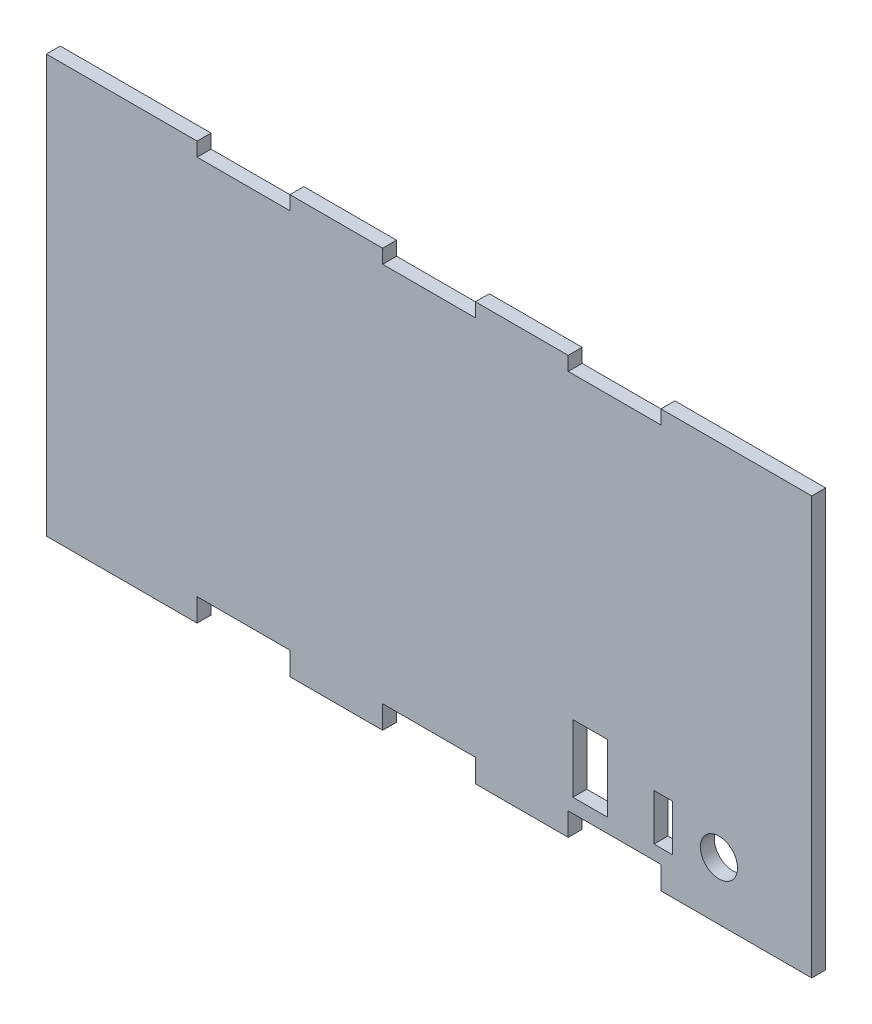
ISO-10303-21;
HEADER;
FILE_DESCRIPTION(('STEP AP214'),'2;1');
FILE_NAME('part.step','',(''),(''),'','','');
FILE_SCHEMA(('AUTOMOTIVE_DESIGN { 1 0 10303 214 1 1 1 1 }'));
ENDSEC;
DATA;
#1=APPLICATION_CONTEXT('core data for automotive mechanical design processes');
#2=APPLICATION_PROTOCOL_DEFINITION('international standard','automotive_design',2000,#1);
#3=PRODUCT_CONTEXT('',#1,'mechanical');
#4=PRODUCT('Part','Part','',(#3));
#5=PRODUCT_RELATED_PRODUCT_CATEGORY('part','',(#4));
#6=PRODUCT_DEFINITION_FORMATION('','',#4);
#7=PRODUCT_DEFINITION_CONTEXT('part definition',#1,'design');
#8=PRODUCT_DEFINITION('design','',#6,#7);
#9=PRODUCT_DEFINITION_SHAPE('','',#8);
#10=(LENGTH_UNIT() NAMED_UNIT(*) SI_UNIT(.MILLI.,.METRE.));
#11=(NAMED_UNIT(*) PLANE_ANGLE_UNIT() SI_UNIT($,.RADIAN.));
#12=(NAMED_UNIT(*) SI_UNIT($,.STERADIAN.) SOLID_ANGLE_UNIT());
#13=UNCERTAINTY_MEASURE_WITH_UNIT(LENGTH_MEASURE(1.E-05),#10,'distance_accuracy_value','');
#14=(GEOMETRIC_REPRESENTATION_CONTEXT(3) GLOBAL_UNCERTAINTY_ASSIGNED_CONTEXT((#13)) GLOBAL_UNIT_ASSIGNED_CONTEXT((#10,
#11,#12)) REPRESENTATION_CONTEXT('',''));
#15=CARTESIAN_POINT('',(0.,0.,0.));
#16=DIRECTION('',(0.,0.,1.));
#17=DIRECTION('',(1.,0.,0.));
#18=AXIS2_PLACEMENT_3D('',#15,#16,#17);
#19=CARTESIAN_POINT('',(0.,0.,6.));
#20=DIRECTION('',(0.,1.,0.));
#21=DIRECTION('',(-1.,0.,0.));
#22=AXIS2_PLACEMENT_3D('',#19,#20,#21);
#23=PLANE('',#22);
#24=DIRECTION('',(1.,0.,0.));
#25=VECTOR('',#24,1.);
#26=CARTESIAN_POINT('',(0.,0.,0.));
#27=LINE('',#26,#25);
#28=CARTESIAN_POINT('',(-145.,0.,0.));
#29=VERTEX_POINT('',#28);
#30=CARTESIAN_POINT('',(-105.,0.,0.));
#31=VERTEX_POINT('',#30);
#32=EDGE_CURVE('E657',#29,#31,#27,.T.);
#33=ORIENTED_EDGE('',*,*,#32,.T.);
#34=DIRECTION('',(0.,0.,1.));
#35=VECTOR('',#34,1.);
#36=CARTESIAN_POINT('',(-105.,0.,0.));
#37=LINE('',#36,#35);
#38=CARTESIAN_POINT('',(-105.,0.,6.));
#39=VERTEX_POINT('',#38);
#40=EDGE_CURVE('E326',#31,#39,#37,.T.);
#41=ORIENTED_EDGE('',*,*,#40,.T.);
#42=DIRECTION('',(1.,0.,0.));
#43=VECTOR('',#42,1.);
#44=CARTESIAN_POINT('',(0.,0.,6.));
#45=LINE('',#44,#43);
#46=CARTESIAN_POINT('',(-145.,0.,6.));
#47=VERTEX_POINT('',#46);
#48=EDGE_CURVE('E671',#47,#39,#45,.T.);
#49=ORIENTED_EDGE('',*,*,#48,.F.);
#50=DIRECTION('',(0.,0.,1.));
#51=VECTOR('',#50,1.);
#52=CARTESIAN_POINT('',(-145.,0.,0.));
#53=LINE('',#52,#51);
#54=EDGE_CURVE('E364',#29,#47,#53,.T.);
#55=ORIENTED_EDGE('',*,*,#54,.F.);
#56=EDGE_LOOP('',(#33,#41,#49,#55));
#57=FACE_BOUND('',#56,.T.);
#58=ADVANCED_FACE('F33',(#57),#23,.F.);
#59=CARTESIAN_POINT('',(-225.,0.,0.));
#60=VERTEX_POINT('',#59);
#61=CARTESIAN_POINT('',(-185.,0.,0.));
#62=VERTEX_POINT('',#61);
#63=EDGE_CURVE('E503',#60,#62,#27,.T.);
#64=ORIENTED_EDGE('',*,*,#63,.T.);
#65=DIRECTION('',(0.,0.,1.));
#66=VECTOR('',#65,1.);
#67=CARTESIAN_POINT('',(-185.,0.,0.));
#68=LINE('',#67,#66);
#69=CARTESIAN_POINT('',(-185.,0.,6.));
#70=VERTEX_POINT('',#69);
#71=EDGE_CURVE('E352',#62,#70,#68,.T.);
#72=ORIENTED_EDGE('',*,*,#71,.T.);
#73=CARTESIAN_POINT('',(-225.,0.,6.));
#74=VERTEX_POINT('',#73);
#75=EDGE_CURVE('E490',#74,#70,#45,.T.);
#76=ORIENTED_EDGE('',*,*,#75,.F.);
#77=DIRECTION('',(0.,0.,1.));
#78=VECTOR('',#77,1.);
#79=CARTESIAN_POINT('',(-225.,0.,0.));
#80=LINE('',#79,#78);
#81=EDGE_CURVE('E390',#60,#74,#80,.T.);
#82=ORIENTED_EDGE('',*,*,#81,.F.);
#83=EDGE_LOOP('',(#64,#72,#76,#82));
#84=FACE_BOUND('',#83,.T.);
#85=ADVANCED_FACE('F552',(#84),#23,.F.);
#86=CARTESIAN_POINT('',(-330.,0.,0.));
#87=VERTEX_POINT('',#86);
#88=CARTESIAN_POINT('',(-265.,0.,0.));
#89=VERTEX_POINT('',#88);
#90=EDGE_CURVE('E478',#87,#89,#27,.T.);
#91=ORIENTED_EDGE('',*,*,#90,.T.);
#92=DIRECTION('',(0.,0.,1.));
#93=VECTOR('',#92,1.);
#94=CARTESIAN_POINT('',(-265.,0.,0.));
#95=LINE('',#94,#93);
#96=CARTESIAN_POINT('',(-265.,0.,6.));
#97=VERTEX_POINT('',#96);
#98=EDGE_CURVE('E378',#89,#97,#95,.T.);
#99=ORIENTED_EDGE('',*,*,#98,.T.);
#100=CARTESIAN_POINT('',(-330.,0.,6.));
#101=VERTEX_POINT('',#100);
#102=EDGE_CURVE('E486',#101,#97,#45,.T.);
#103=ORIENTED_EDGE('',*,*,#102,.F.);
#104=DIRECTION('',(0.,0.,-1.));
#105=VECTOR('',#104,1.);
#106=CARTESIAN_POINT('',(-330.,0.,6.));
#107=LINE('',#106,#105);
#108=EDGE_CURVE('E506',#101,#87,#107,.T.);
#109=ORIENTED_EDGE('',*,*,#108,.T.);
#110=EDGE_LOOP('',(#91,#99,#103,#109));
#111=FACE_BOUND('',#110,.T.);
#112=ADVANCED_FACE('F559',(#111),#23,.F.);
#113=CARTESIAN_POINT('',(0.,180.,6.));
#114=DIRECTION('',(0.,-1.,0.));
#115=DIRECTION('',(1.,0.,0.));
#116=AXIS2_PLACEMENT_3D('',#113,#114,#115);
#117=PLANE('',#116);
#118=DIRECTION('',(-1.,0.,0.));
#119=VECTOR('',#118,1.);
#120=CARTESIAN_POINT('',(0.,180.,6.));
#121=LINE('',#120,#119);
#122=CARTESIAN_POINT('',(-105.,180.,6.));
#123=VERTEX_POINT('',#122);
#124=CARTESIAN_POINT('',(-145.,180.,6.));
#125=VERTEX_POINT('',#124);
#126=EDGE_CURVE('E483',#123,#125,#121,.T.);
#127=ORIENTED_EDGE('',*,*,#126,.F.);
#128=DIRECTION('',(0.,0.,1.));
#129=VECTOR('',#128,1.);
#130=CARTESIAN_POINT('',(-105.,180.,0.));
#131=LINE('',#130,#129);
#132=CARTESIAN_POINT('',(-105.,180.,0.));
#133=VERTEX_POINT('',#132);
#134=EDGE_CURVE('E411',#133,#123,#131,.T.);
#135=ORIENTED_EDGE('',*,*,#134,.F.);
#136=DIRECTION('',(-1.,0.,0.));
#137=VECTOR('',#136,1.);
#138=CARTESIAN_POINT('',(0.,180.,0.));
#139=LINE('',#138,#137);
#140=CARTESIAN_POINT('',(-145.,180.,0.));
#141=VERTEX_POINT('',#140);
#142=EDGE_CURVE('E498',#133,#141,#139,.T.);
#143=ORIENTED_EDGE('',*,*,#142,.T.);
#144=DIRECTION('',(0.,0.,1.));
#145=VECTOR('',#144,1.);
#146=CARTESIAN_POINT('',(-145.,180.,0.));
#147=LINE('',#146,#145);
#148=EDGE_CURVE('E441',#141,#125,#147,.T.);
#149=ORIENTED_EDGE('',*,*,#148,.T.);
#150=EDGE_LOOP('',(#127,#135,#143,#149));
#151=FACE_BOUND('',#150,.T.);
#152=ADVANCED_FACE('F578',(#151),#117,.F.);
#153=CARTESIAN_POINT('',(-185.,180.,6.));
#154=VERTEX_POINT('',#153);
#155=CARTESIAN_POINT('',(-225.,180.,6.));
#156=VERTEX_POINT('',#155);
#157=EDGE_CURVE('E626',#154,#156,#121,.T.);
#158=ORIENTED_EDGE('',*,*,#157,.F.);
#159=DIRECTION('',(0.,0.,1.));
#160=VECTOR('',#159,1.);
#161=CARTESIAN_POINT('',(-185.,180.,0.));
#162=LINE('',#161,#160);
#163=CARTESIAN_POINT('',(-185.,180.,0.));
#164=VERTEX_POINT('',#163);
#165=EDGE_CURVE('E438',#164,#154,#162,.T.);
#166=ORIENTED_EDGE('',*,*,#165,.F.);
#167=CARTESIAN_POINT('',(-225.,180.,0.));
#168=VERTEX_POINT('',#167);
#169=EDGE_CURVE('E606',#164,#168,#139,.T.);
#170=ORIENTED_EDGE('',*,*,#169,.T.);
#171=DIRECTION('',(0.,0.,1.));
#172=VECTOR('',#171,1.);
#173=CARTESIAN_POINT('',(-225.,180.,0.));
#174=LINE('',#173,#172);
#175=EDGE_CURVE('E468',#168,#156,#174,.T.);
#176=ORIENTED_EDGE('',*,*,#175,.T.);
#177=EDGE_LOOP('',(#158,#166,#170,#176));
#178=FACE_BOUND('',#177,.T.);
#179=ADVANCED_FACE('F583',(#178),#117,.F.);
#180=CARTESIAN_POINT('',(-265.,180.,6.));
#181=VERTEX_POINT('',#180);
#182=CARTESIAN_POINT('',(-330.,180.,6.));
#183=VERTEX_POINT('',#182);
#184=EDGE_CURVE('E477',#181,#183,#121,.T.);
#185=ORIENTED_EDGE('',*,*,#184,.F.);
#186=DIRECTION('',(0.,0.,1.));
#187=VECTOR('',#186,1.);
#188=CARTESIAN_POINT('',(-265.,180.,0.));
#189=LINE('',#188,#187);
#190=CARTESIAN_POINT('',(-265.,180.,0.));
#191=VERTEX_POINT('',#190);
#192=EDGE_CURVE('E465',#191,#181,#189,.T.);
#193=ORIENTED_EDGE('',*,*,#192,.F.);
#194=CARTESIAN_POINT('',(-330.,180.,0.));
#195=VERTEX_POINT('',#194);
#196=EDGE_CURVE('E493',#191,#195,#139,.T.);
#197=ORIENTED_EDGE('',*,*,#196,.T.);
#198=DIRECTION('',(0.,0.,-1.));
#199=VECTOR('',#198,1.);
#200=CARTESIAN_POINT('',(-330.,180.,6.));
#201=LINE('',#200,#199);
#202=EDGE_CURVE('E509',#183,#195,#201,.T.);
#203=ORIENTED_EDGE('',*,*,#202,.F.);
#204=EDGE_LOOP('',(#185,#193,#197,#203));
#205=FACE_BOUND('',#204,.T.);
#206=ADVANCED_FACE('F604',(#205),#117,.F.);
#207=CARTESIAN_POINT('',(0.,0.,6.));
#208=DIRECTION('',(-1.,0.,0.));
#209=DIRECTION('',(0.,0.,1.));
#210=AXIS2_PLACEMENT_3D('',#207,#208,#209);
#211=PLANE('',#210);
#212=DIRECTION('',(0.,1.,0.));
#213=VECTOR('',#212,1.);
#214=CARTESIAN_POINT('',(0.,0.,0.));
#215=LINE('',#214,#213);
#216=CARTESIAN_POINT('',(0.,0.,0.));
#217=VERTEX_POINT('',#216);
#218=CARTESIAN_POINT('',(0.,180.,0.));
#219=VERTEX_POINT('',#218);
#220=EDGE_CURVE('E467',#217,#219,#215,.T.);
#221=ORIENTED_EDGE('',*,*,#220,.T.);
#222=DIRECTION('',(0.,0.,-1.));
#223=VECTOR('',#222,1.);
#224=CARTESIAN_POINT('',(0.,180.,6.));
#225=LINE('',#224,#223);
#226=CARTESIAN_POINT('',(0.,180.,6.));
#227=VERTEX_POINT('',#226);
#228=EDGE_CURVE('E512',#227,#219,#225,.T.);
#229=ORIENTED_EDGE('',*,*,#228,.F.);
#230=DIRECTION('',(0.,1.,0.));
#231=VECTOR('',#230,1.);
#232=CARTESIAN_POINT('',(0.,0.,6.));
#233=LINE('',#232,#231);
#234=CARTESIAN_POINT('',(0.,0.,6.));
#235=VERTEX_POINT('',#234);
#236=EDGE_CURVE('E474',#235,#227,#233,.T.);
#237=ORIENTED_EDGE('',*,*,#236,.F.);
#238=DIRECTION('',(0.,0.,-1.));
#239=VECTOR('',#238,1.);
#240=CARTESIAN_POINT('',(0.,0.,6.));
#241=LINE('',#240,#239);
#242=EDGE_CURVE('E489',#235,#217,#241,.T.);
#243=ORIENTED_EDGE('',*,*,#242,.T.);
#244=EDGE_LOOP('',(#221,#229,#237,#243));
#245=FACE_BOUND('',#244,.T.);
#246=ADVANCED_FACE('F35',(#245),#211,.F.);
#247=CARTESIAN_POINT('',(-65.,180.,0.));
#248=VERTEX_POINT('',#247);
#249=EDGE_CURVE('E494',#219,#248,#139,.T.);
#250=ORIENTED_EDGE('',*,*,#249,.T.);
#251=DIRECTION('',(0.,0.,1.));
#252=VECTOR('',#251,1.);
#253=CARTESIAN_POINT('',(-65.,180.,0.));
#254=LINE('',#253,#252);
#255=CARTESIAN_POINT('',(-65.,180.,6.));
#256=VERTEX_POINT('',#255);
#257=EDGE_CURVE('E414',#248,#256,#254,.T.);
#258=ORIENTED_EDGE('',*,*,#257,.T.);
#259=EDGE_CURVE('E479',#227,#256,#121,.T.);
#260=ORIENTED_EDGE('',*,*,#259,.F.);
#261=ORIENTED_EDGE('',*,*,#228,.T.);
#262=EDGE_LOOP('',(#250,#258,#260,#261));
#263=FACE_BOUND('',#262,.T.);
#264=ADVANCED_FACE('F574',(#263),#117,.F.);
#265=CARTESIAN_POINT('',(-330.,0.,6.));
#266=DIRECTION('',(1.,0.,0.));
#267=DIRECTION('',(0.,0.,-1.));
#268=AXIS2_PLACEMENT_3D('',#265,#266,#267);
#269=PLANE('',#268);
#270=DIRECTION('',(0.,-1.,0.));
#271=VECTOR('',#270,1.);
#272=CARTESIAN_POINT('',(-330.,0.,0.));
#273=LINE('',#272,#271);
#274=EDGE_CURVE('E497',#195,#87,#273,.T.);
#275=ORIENTED_EDGE('',*,*,#274,.T.);
#276=ORIENTED_EDGE('',*,*,#108,.F.);
#277=DIRECTION('',(0.,-1.,0.));
#278=VECTOR('',#277,1.);
#279=CARTESIAN_POINT('',(-330.,0.,6.));
#280=LINE('',#279,#278);
#281=EDGE_CURVE('E482',#183,#101,#280,.T.);
#282=ORIENTED_EDGE('',*,*,#281,.F.);
#283=ORIENTED_EDGE('',*,*,#202,.T.);
#284=EDGE_LOOP('',(#275,#276,#282,#283));
#285=FACE_BOUND('',#284,.T.);
#286=ADVANCED_FACE('F565',(#285),#269,.F.);
#287=CARTESIAN_POINT('',(-65.,0.,6.));
#288=VERTEX_POINT('',#287);
#289=EDGE_CURVE('E485',#288,#235,#45,.T.);
#290=ORIENTED_EDGE('',*,*,#289,.F.);
#291=DIRECTION('',(0.,0.,1.));
#292=VECTOR('',#291,1.);
#293=CARTESIAN_POINT('',(-65.,0.,0.));
#294=LINE('',#293,#292);
#295=CARTESIAN_POINT('',(-65.,0.,0.));
#296=VERTEX_POINT('',#295);
#297=EDGE_CURVE('E338',#296,#288,#294,.T.);
#298=ORIENTED_EDGE('',*,*,#297,.F.);
#299=EDGE_CURVE('E500',#296,#217,#27,.T.);
#300=ORIENTED_EDGE('',*,*,#299,.T.);
#301=ORIENTED_EDGE('',*,*,#242,.F.);
#302=EDGE_LOOP('',(#290,#298,#300,#301));
#303=FACE_BOUND('',#302,.T.);
#304=ADVANCED_FACE('F555',(#303),#23,.F.);
#305=CARTESIAN_POINT('',(0.,0.,6.));
#306=DIRECTION('',(0.,0.,1.));
#307=DIRECTION('',(1.,0.,0.));
#308=AXIS2_PLACEMENT_3D('',#305,#306,#307);
#309=PLANE('',#308);
#310=CARTESIAN_POINT('',(-40.,25.,6.));
#311=DIRECTION('',(0.,0.,1.));
#312=DIRECTION('',(1.,0.,0.));
#313=AXIS2_PLACEMENT_3D('',#310,#311,#312);
#314=CIRCLE('',#313,8.00000000000001);
#315=CARTESIAN_POINT('',(-32.,25.,6.));
#316=VERTEX_POINT('',#315);
#317=EDGE_CURVE('E750',#316,#316,#314,.T.);
#318=ORIENTED_EDGE('',*,*,#317,.F.);
#319=EDGE_LOOP('',(#318));
#320=FACE_BOUND('',#319,.T.);
#321=DIRECTION('',(0.,-1.,0.));
#322=VECTOR('',#321,1.);
#323=CARTESIAN_POINT('',(-68.,36.,6.));
#324=LINE('',#323,#322);
#325=CARTESIAN_POINT('',(-68.,36.,6.));
#326=VERTEX_POINT('',#325);
#327=CARTESIAN_POINT('',(-68.,16.,6.));
#328=VERTEX_POINT('',#327);
#329=EDGE_CURVE('E49',#326,#328,#324,.T.);
#330=ORIENTED_EDGE('',*,*,#329,.F.);
#331=DIRECTION('',(-1.,0.,0.));
#332=VECTOR('',#331,1.);
#333=CARTESIAN_POINT('',(-68.,36.,6.));
#334=LINE('',#333,#332);
#335=CARTESIAN_POINT('',(-60.,36.,6.));
#336=VERTEX_POINT('',#335);
#337=EDGE_CURVE('E286',#336,#326,#334,.T.);
#338=ORIENTED_EDGE('',*,*,#337,.F.);
#339=DIRECTION('',(0.,1.,0.));
#340=VECTOR('',#339,1.);
#341=CARTESIAN_POINT('',(-60.,36.,6.));
#342=LINE('',#341,#340);
#343=CARTESIAN_POINT('',(-60.,16.,6.));
#344=VERTEX_POINT('',#343);
#345=EDGE_CURVE('E270',#344,#336,#342,.T.);
#346=ORIENTED_EDGE('',*,*,#345,.F.);
#347=DIRECTION('',(1.,0.,0.));
#348=VECTOR('',#347,1.);
#349=CARTESIAN_POINT('',(-68.,16.,6.));
#350=LINE('',#349,#348);
#351=EDGE_CURVE('E279',#328,#344,#350,.T.);
#352=ORIENTED_EDGE('',*,*,#351,.F.);
#353=EDGE_LOOP('',(#330,#338,#346,#352));
#354=FACE_BOUND('',#353,.T.);
#355=DIRECTION('',(0.,-1.,0.));
#356=VECTOR('',#355,1.);
#357=CARTESIAN_POINT('',(-103.,45.,6.));
#358=LINE('',#357,#356);
#359=CARTESIAN_POINT('',(-103.,45.,6.));
#360=VERTEX_POINT('',#359);
#361=CARTESIAN_POINT('',(-103.,16.,6.));
#362=VERTEX_POINT('',#361);
#363=EDGE_CURVE('E293',#360,#362,#358,.T.);
#364=ORIENTED_EDGE('',*,*,#363,.F.);
#365=DIRECTION('',(-1.,0.,0.));
#366=VECTOR('',#365,1.);
#367=CARTESIAN_POINT('',(-103.,45.,6.));
#368=LINE('',#367,#366);
#369=CARTESIAN_POINT('',(-88.,45.,6.));
#370=VERTEX_POINT('',#369);
#371=EDGE_CURVE('E303',#370,#360,#368,.T.);
#372=ORIENTED_EDGE('',*,*,#371,.F.);
#373=DIRECTION('',(0.,1.,0.));
#374=VECTOR('',#373,1.);
#375=CARTESIAN_POINT('',(-88.,45.,6.));
#376=LINE('',#375,#374);
#377=CARTESIAN_POINT('',(-88.,16.,6.));
#378=VERTEX_POINT('',#377);
#379=EDGE_CURVE('E300',#378,#370,#376,.T.);
#380=ORIENTED_EDGE('',*,*,#379,.F.);
#381=DIRECTION('',(1.,0.,0.));
#382=VECTOR('',#381,1.);
#383=CARTESIAN_POINT('',(-103.,16.,6.));
#384=LINE('',#383,#382);
#385=EDGE_CURVE('E297',#362,#378,#384,.T.);
#386=ORIENTED_EDGE('',*,*,#385,.F.);
#387=EDGE_LOOP('',(#364,#372,#380,#386));
#388=FACE_BOUND('',#387,.T.);
#389=DIRECTION('',(0.,-1.,0.));
#390=VECTOR('',#389,1.);
#391=CARTESIAN_POINT('',(-105.,0.,6.));
#392=LINE('',#391,#390);
#393=CARTESIAN_POINT('',(-105.,9.90358590712503,6.));
#394=VERTEX_POINT('',#393);
#395=EDGE_CURVE('E309',#394,#39,#392,.T.);
#396=ORIENTED_EDGE('',*,*,#395,.F.);
#397=DIRECTION('',(-1.,0.,0.));
#398=VECTOR('',#397,1.);
#399=CARTESIAN_POINT('',(-105.,9.90358590712503,6.));
#400=LINE('',#399,#398);
#401=CARTESIAN_POINT('',(-65.,9.90358590712503,6.));
#402=VERTEX_POINT('',#401);
#403=EDGE_CURVE('E320',#402,#394,#400,.T.);
#404=ORIENTED_EDGE('',*,*,#403,.F.);
#405=DIRECTION('',(0.,1.,0.));
#406=VECTOR('',#405,1.);
#407=CARTESIAN_POINT('',(-65.,0.,6.));
#408=LINE('',#407,#406);
#409=EDGE_CURVE('E328',#288,#402,#408,.T.);
#410=ORIENTED_EDGE('',*,*,#409,.F.);
#411=ORIENTED_EDGE('',*,*,#289,.T.);
#412=ORIENTED_EDGE('',*,*,#236,.T.);
#413=ORIENTED_EDGE('',*,*,#259,.T.);
#414=DIRECTION('',(0.,1.,0.));
#415=VECTOR('',#414,1.);
#416=CARTESIAN_POINT('',(-65.,180.,6.));
#417=LINE('',#416,#415);
#418=CARTESIAN_POINT('',(-65.,174.,6.));
#419=VERTEX_POINT('',#418);
#420=EDGE_CURVE('E398',#419,#256,#417,.T.);
#421=ORIENTED_EDGE('',*,*,#420,.F.);
#422=DIRECTION('',(1.,0.,0.));
#423=VECTOR('',#422,1.);
#424=CARTESIAN_POINT('',(-105.,174.,6.));
#425=LINE('',#424,#423);
#426=CARTESIAN_POINT('',(-105.,174.,6.));
#427=VERTEX_POINT('',#426);
#428=EDGE_CURVE('E407',#427,#419,#425,.T.);
#429=ORIENTED_EDGE('',*,*,#428,.F.);
#430=DIRECTION('',(0.,-1.,0.));
#431=VECTOR('',#430,1.);
#432=CARTESIAN_POINT('',(-105.,180.,6.));
#433=LINE('',#432,#431);
#434=EDGE_CURVE('E387',#123,#427,#433,.T.);
#435=ORIENTED_EDGE('',*,*,#434,.F.);
#436=ORIENTED_EDGE('',*,*,#126,.T.);
#437=DIRECTION('',(0.,1.,0.));
#438=VECTOR('',#437,1.);
#439=CARTESIAN_POINT('',(-145.,180.,6.));
#440=LINE('',#439,#438);
#441=CARTESIAN_POINT('',(-145.,174.,6.));
#442=VERTEX_POINT('',#441);
#443=EDGE_CURVE('E424',#442,#125,#440,.T.);
#444=ORIENTED_EDGE('',*,*,#443,.F.);
#445=DIRECTION('',(1.,0.,0.));
#446=VECTOR('',#445,1.);
#447=CARTESIAN_POINT('',(-185.,174.,6.));
#448=LINE('',#447,#446);
#449=CARTESIAN_POINT('',(-185.,174.,6.));
#450=VERTEX_POINT('',#449);
#451=EDGE_CURVE('E433',#450,#442,#448,.T.);
#452=ORIENTED_EDGE('',*,*,#451,.F.);
#453=DIRECTION('',(0.,-1.,0.));
#454=VECTOR('',#453,1.);
#455=CARTESIAN_POINT('',(-185.,180.,6.));
#456=LINE('',#455,#454);
#457=EDGE_CURVE('E413',#154,#450,#456,.T.);
#458=ORIENTED_EDGE('',*,*,#457,.F.);
#459=ORIENTED_EDGE('',*,*,#157,.T.);
#460=DIRECTION('',(0.,1.,0.));
#461=VECTOR('',#460,1.);
#462=CARTESIAN_POINT('',(-225.,180.,6.));
#463=LINE('',#462,#461);
#464=CARTESIAN_POINT('',(-225.,174.,6.));
#465=VERTEX_POINT('',#464);
#466=EDGE_CURVE('E451',#465,#156,#463,.T.);
#467=ORIENTED_EDGE('',*,*,#466,.F.);
#468=DIRECTION('',(1.,0.,0.));
#469=VECTOR('',#468,1.);
#470=CARTESIAN_POINT('',(-265.,174.,6.));
#471=LINE('',#470,#469);
#472=CARTESIAN_POINT('',(-265.,174.,6.));
#473=VERTEX_POINT('',#472);
#474=EDGE_CURVE('E460',#473,#465,#471,.T.);
#475=ORIENTED_EDGE('',*,*,#474,.F.);
#476=DIRECTION('',(0.,-1.,0.));
#477=VECTOR('',#476,1.);
#478=CARTESIAN_POINT('',(-265.,180.,6.));
#479=LINE('',#478,#477);
#480=EDGE_CURVE('E440',#181,#473,#479,.T.);
#481=ORIENTED_EDGE('',*,*,#480,.F.);
#482=ORIENTED_EDGE('',*,*,#184,.T.);
#483=ORIENTED_EDGE('',*,*,#281,.T.);
#484=ORIENTED_EDGE('',*,*,#102,.T.);
#485=DIRECTION('',(0.,-1.,0.));
#486=VECTOR('',#485,1.);
#487=CARTESIAN_POINT('',(-265.,0.,6.));
#488=LINE('',#487,#486);
#489=CARTESIAN_POINT('',(-265.,9.90358590712503,6.));
#490=VERTEX_POINT('',#489);
#491=EDGE_CURVE('E361',#490,#97,#488,.T.);
#492=ORIENTED_EDGE('',*,*,#491,.F.);
#493=DIRECTION('',(-1.,0.,0.));
#494=VECTOR('',#493,1.);
#495=CARTESIAN_POINT('',(-265.,9.90358590712503,6.));
#496=LINE('',#495,#494);
#497=CARTESIAN_POINT('',(-225.,9.90358590712503,6.));
#498=VERTEX_POINT('',#497);
#499=EDGE_CURVE('E372',#498,#490,#496,.T.);
#500=ORIENTED_EDGE('',*,*,#499,.F.);
#501=DIRECTION('',(0.,1.,0.));
#502=VECTOR('',#501,1.);
#503=CARTESIAN_POINT('',(-225.,0.,6.));
#504=LINE('',#503,#502);
#505=EDGE_CURVE('E380',#74,#498,#504,.T.);
#506=ORIENTED_EDGE('',*,*,#505,.F.);
#507=ORIENTED_EDGE('',*,*,#75,.T.);
#508=DIRECTION('',(0.,-1.,0.));
#509=VECTOR('',#508,1.);
#510=CARTESIAN_POINT('',(-185.,0.,6.));
#511=LINE('',#510,#509);
#512=CARTESIAN_POINT('',(-185.,9.90358590712503,6.));
#513=VERTEX_POINT('',#512);
#514=EDGE_CURVE('E335',#513,#70,#511,.T.);
#515=ORIENTED_EDGE('',*,*,#514,.F.);
#516=DIRECTION('',(-1.,0.,0.));
#517=VECTOR('',#516,1.);
#518=CARTESIAN_POINT('',(-185.,9.90358590712503,6.));
#519=LINE('',#518,#517);
#520=CARTESIAN_POINT('',(-145.,9.90358590712503,6.));
#521=VERTEX_POINT('',#520);
#522=EDGE_CURVE('E346',#521,#513,#519,.T.);
#523=ORIENTED_EDGE('',*,*,#522,.F.);
#524=DIRECTION('',(0.,1.,0.));
#525=VECTOR('',#524,1.);
#526=CARTESIAN_POINT('',(-145.,0.,6.));
#527=LINE('',#526,#525);
#528=EDGE_CURVE('E354',#47,#521,#527,.T.);
#529=ORIENTED_EDGE('',*,*,#528,.F.);
#530=ORIENTED_EDGE('',*,*,#48,.T.);
#531=EDGE_LOOP('',(#396,#404,#410,#411,#412,#413,#421,#429,#435,#436,#444,#452,#458,#459,#467,
#475,#481,#482,#483,#484,#492,#500,#506,#507,#515,#523,#529,#530));
#532=FACE_BOUND('',#531,.T.);
#533=ADVANCED_FACE('F283',(#320,#354,#388,#532),#309,.T.);
#534=CARTESIAN_POINT('',(0.,0.,0.));
#535=DIRECTION('',(0.,0.,1.));
#536=DIRECTION('',(1.,0.,0.));
#537=AXIS2_PLACEMENT_3D('',#534,#535,#536);
#538=PLANE('',#537);
#539=CARTESIAN_POINT('',(-40.,25.,0.));
#540=DIRECTION('',(0.,0.,1.));
#541=DIRECTION('',(1.,0.,0.));
#542=AXIS2_PLACEMENT_3D('',#539,#540,#541);
#543=CIRCLE('',#542,8.00000000000001);
#544=CARTESIAN_POINT('',(-32.,25.,0.));
#545=VERTEX_POINT('',#544);
#546=EDGE_CURVE('E37',#545,#545,#543,.T.);
#547=ORIENTED_EDGE('',*,*,#546,.T.);
#548=EDGE_LOOP('',(#547));
#549=FACE_BOUND('',#548,.T.);
#550=DIRECTION('',(-1.,0.,0.));
#551=VECTOR('',#550,1.);
#552=CARTESIAN_POINT('',(0.,36.,0.));
#553=LINE('',#552,#551);
#554=CARTESIAN_POINT('',(-60.,36.,0.));
#555=VERTEX_POINT('',#554);
#556=CARTESIAN_POINT('',(-68.,36.,0.));
#557=VERTEX_POINT('',#556);
#558=EDGE_CURVE('E42',#555,#557,#553,.T.);
#559=ORIENTED_EDGE('',*,*,#558,.T.);
#560=DIRECTION('',(0.,-1.,0.));
#561=VECTOR('',#560,1.);
#562=CARTESIAN_POINT('',(-68.,0.,0.));
#563=LINE('',#562,#561);
#564=CARTESIAN_POINT('',(-68.,16.,0.));
#565=VERTEX_POINT('',#564);
#566=EDGE_CURVE('E11',#557,#565,#563,.T.);
#567=ORIENTED_EDGE('',*,*,#566,.T.);
#568=DIRECTION('',(1.,0.,0.));
#569=VECTOR('',#568,1.);
#570=CARTESIAN_POINT('',(0.,16.,0.));
#571=LINE('',#570,#569);
#572=CARTESIAN_POINT('',(-60.,16.,0.));
#573=VERTEX_POINT('',#572);
#574=EDGE_CURVE('E527',#565,#573,#571,.T.);
#575=ORIENTED_EDGE('',*,*,#574,.T.);
#576=DIRECTION('',(0.,1.,0.));
#577=VECTOR('',#576,1.);
#578=CARTESIAN_POINT('',(-60.,0.,0.));
#579=LINE('',#578,#577);
#580=EDGE_CURVE('E273',#573,#555,#579,.T.);
#581=ORIENTED_EDGE('',*,*,#580,.T.);
#582=EDGE_LOOP('',(#559,#567,#575,#581));
#583=FACE_BOUND('',#582,.T.);
#584=DIRECTION('',(-1.,0.,0.));
#585=VECTOR('',#584,1.);
#586=CARTESIAN_POINT('',(0.,45.,0.));
#587=LINE('',#586,#585);
#588=CARTESIAN_POINT('',(-88.,45.,0.));
#589=VERTEX_POINT('',#588);
#590=CARTESIAN_POINT('',(-103.,45.,0.));
#591=VERTEX_POINT('',#590);
#592=EDGE_CURVE('E521',#589,#591,#587,.T.);
#593=ORIENTED_EDGE('',*,*,#592,.T.);
#594=DIRECTION('',(0.,-1.,0.));
#595=VECTOR('',#594,1.);
#596=CARTESIAN_POINT('',(-103.,0.,0.));
#597=LINE('',#596,#595);
#598=CARTESIAN_POINT('',(-103.,16.,0.));
#599=VERTEX_POINT('',#598);
#600=EDGE_CURVE('E524',#591,#599,#597,.T.);
#601=ORIENTED_EDGE('',*,*,#600,.T.);
#602=DIRECTION('',(1.,0.,0.));
#603=VECTOR('',#602,1.);
#604=CARTESIAN_POINT('',(0.,16.,0.));
#605=LINE('',#604,#603);
#606=CARTESIAN_POINT('',(-88.,16.,0.));
#607=VERTEX_POINT('',#606);
#608=EDGE_CURVE('E515',#599,#607,#605,.T.);
#609=ORIENTED_EDGE('',*,*,#608,.T.);
#610=DIRECTION('',(0.,1.,0.));
#611=VECTOR('',#610,1.);
#612=CARTESIAN_POINT('',(-88.,0.,0.));
#613=LINE('',#612,#611);
#614=EDGE_CURVE('E518',#607,#589,#613,.T.);
#615=ORIENTED_EDGE('',*,*,#614,.T.);
#616=EDGE_LOOP('',(#593,#601,#609,#615));
#617=FACE_BOUND('',#616,.T.);
#618=DIRECTION('',(-1.,0.,0.));
#619=VECTOR('',#618,1.);
#620=CARTESIAN_POINT('',(-105.,9.90358590712503,0.));
#621=LINE('',#620,#619);
#622=CARTESIAN_POINT('',(-65.,9.90358590712503,0.));
#623=VERTEX_POINT('',#622);
#624=CARTESIAN_POINT('',(-105.,9.90358590712503,0.));
#625=VERTEX_POINT('',#624);
#626=EDGE_CURVE('E323',#623,#625,#621,.T.);
#627=ORIENTED_EDGE('',*,*,#626,.T.);
#628=DIRECTION('',(0.,-1.,0.));
#629=VECTOR('',#628,1.);
#630=CARTESIAN_POINT('',(-105.,0.,0.));
#631=LINE('',#630,#629);
#632=EDGE_CURVE('E316',#625,#31,#631,.T.);
#633=ORIENTED_EDGE('',*,*,#632,.T.);
#634=ORIENTED_EDGE('',*,*,#32,.F.);
#635=DIRECTION('',(0.,1.,0.));
#636=VECTOR('',#635,1.);
#637=CARTESIAN_POINT('',(-145.,0.,0.));
#638=LINE('',#637,#636);
#639=CARTESIAN_POINT('',(-145.,9.90358590712503,0.));
#640=VERTEX_POINT('',#639);
#641=EDGE_CURVE('E345',#29,#640,#638,.T.);
#642=ORIENTED_EDGE('',*,*,#641,.T.);
#643=DIRECTION('',(-1.,0.,0.));
#644=VECTOR('',#643,1.);
#645=CARTESIAN_POINT('',(-185.,9.90358590712503,0.));
#646=LINE('',#645,#644);
#647=CARTESIAN_POINT('',(-185.,9.90358590712503,0.));
#648=VERTEX_POINT('',#647);
#649=EDGE_CURVE('E349',#640,#648,#646,.T.);
#650=ORIENTED_EDGE('',*,*,#649,.T.);
#651=DIRECTION('',(0.,-1.,0.));
#652=VECTOR('',#651,1.);
#653=CARTESIAN_POINT('',(-185.,0.,0.));
#654=LINE('',#653,#652);
#655=EDGE_CURVE('E342',#648,#62,#654,.T.);
#656=ORIENTED_EDGE('',*,*,#655,.T.);
#657=ORIENTED_EDGE('',*,*,#63,.F.);
#658=DIRECTION('',(0.,1.,0.));
#659=VECTOR('',#658,1.);
#660=CARTESIAN_POINT('',(-225.,0.,0.));
#661=LINE('',#660,#659);
#662=CARTESIAN_POINT('',(-225.,9.90358590712503,0.));
#663=VERTEX_POINT('',#662);
#664=EDGE_CURVE('E371',#60,#663,#661,.T.);
#665=ORIENTED_EDGE('',*,*,#664,.T.);
#666=DIRECTION('',(-1.,0.,0.));
#667=VECTOR('',#666,1.);
#668=CARTESIAN_POINT('',(-265.,9.90358590712503,0.));
#669=LINE('',#668,#667);
#670=CARTESIAN_POINT('',(-265.,9.90358590712503,0.));
#671=VERTEX_POINT('',#670);
#672=EDGE_CURVE('E375',#663,#671,#669,.T.);
#673=ORIENTED_EDGE('',*,*,#672,.T.);
#674=DIRECTION('',(0.,-1.,0.));
#675=VECTOR('',#674,1.);
#676=CARTESIAN_POINT('',(-265.,0.,0.));
#677=LINE('',#676,#675);
#678=EDGE_CURVE('E368',#671,#89,#677,.T.);
#679=ORIENTED_EDGE('',*,*,#678,.T.);
#680=ORIENTED_EDGE('',*,*,#90,.F.);
#681=ORIENTED_EDGE('',*,*,#274,.F.);
#682=ORIENTED_EDGE('',*,*,#196,.F.);
#683=DIRECTION('',(0.,-1.,0.));
#684=VECTOR('',#683,1.);
#685=CARTESIAN_POINT('',(-265.,180.,0.));
#686=LINE('',#685,#684);
#687=CARTESIAN_POINT('',(-265.,174.,0.));
#688=VERTEX_POINT('',#687);
#689=EDGE_CURVE('E447',#191,#688,#686,.T.);
#690=ORIENTED_EDGE('',*,*,#689,.T.);
#691=DIRECTION('',(1.,0.,0.));
#692=VECTOR('',#691,1.);
#693=CARTESIAN_POINT('',(-265.,174.,0.));
#694=LINE('',#693,#692);
#695=CARTESIAN_POINT('',(-225.,174.,0.));
#696=VERTEX_POINT('',#695);
#697=EDGE_CURVE('E450',#688,#696,#694,.T.);
#698=ORIENTED_EDGE('',*,*,#697,.T.);
#699=DIRECTION('',(0.,1.,0.));
#700=VECTOR('',#699,1.);
#701=CARTESIAN_POINT('',(-225.,180.,0.));
#702=LINE('',#701,#700);
#703=EDGE_CURVE('E454',#696,#168,#702,.T.);
#704=ORIENTED_EDGE('',*,*,#703,.T.);
#705=ORIENTED_EDGE('',*,*,#169,.F.);
#706=DIRECTION('',(0.,-1.,0.));
#707=VECTOR('',#706,1.);
#708=CARTESIAN_POINT('',(-185.,180.,0.));
#709=LINE('',#708,#707);
#710=CARTESIAN_POINT('',(-185.,174.,0.));
#711=VERTEX_POINT('',#710);
#712=EDGE_CURVE('E420',#164,#711,#709,.T.);
#713=ORIENTED_EDGE('',*,*,#712,.T.);
#714=DIRECTION('',(1.,0.,0.));
#715=VECTOR('',#714,1.);
#716=CARTESIAN_POINT('',(-185.,174.,0.));
#717=LINE('',#716,#715);
#718=CARTESIAN_POINT('',(-145.,174.,0.));
#719=VERTEX_POINT('',#718);
#720=EDGE_CURVE('E423',#711,#719,#717,.T.);
#721=ORIENTED_EDGE('',*,*,#720,.T.);
#722=DIRECTION('',(0.,1.,0.));
#723=VECTOR('',#722,1.);
#724=CARTESIAN_POINT('',(-145.,180.,0.));
#725=LINE('',#724,#723);
#726=EDGE_CURVE('E427',#719,#141,#725,.T.);
#727=ORIENTED_EDGE('',*,*,#726,.T.);
#728=ORIENTED_EDGE('',*,*,#142,.F.);
#729=DIRECTION('',(0.,-1.,0.));
#730=VECTOR('',#729,1.);
#731=CARTESIAN_POINT('',(-105.,180.,0.));
#732=LINE('',#731,#730);
#733=CARTESIAN_POINT('',(-105.,174.,0.));
#734=VERTEX_POINT('',#733);
#735=EDGE_CURVE('E394',#133,#734,#732,.T.);
#736=ORIENTED_EDGE('',*,*,#735,.T.);
#737=DIRECTION('',(1.,0.,0.));
#738=VECTOR('',#737,1.);
#739=CARTESIAN_POINT('',(-105.,174.,0.));
#740=LINE('',#739,#738);
#741=CARTESIAN_POINT('',(-65.,174.,0.));
#742=VERTEX_POINT('',#741);
#743=EDGE_CURVE('E397',#734,#742,#740,.T.);
#744=ORIENTED_EDGE('',*,*,#743,.T.);
#745=DIRECTION('',(0.,1.,0.));
#746=VECTOR('',#745,1.);
#747=CARTESIAN_POINT('',(-65.,180.,0.));
#748=LINE('',#747,#746);
#749=EDGE_CURVE('E401',#742,#248,#748,.T.);
#750=ORIENTED_EDGE('',*,*,#749,.T.);
#751=ORIENTED_EDGE('',*,*,#249,.F.);
#752=ORIENTED_EDGE('',*,*,#220,.F.);
#753=ORIENTED_EDGE('',*,*,#299,.F.);
#754=DIRECTION('',(0.,1.,0.));
#755=VECTOR('',#754,1.);
#756=CARTESIAN_POINT('',(-65.,0.,0.));
#757=LINE('',#756,#755);
#758=EDGE_CURVE('E319',#296,#623,#757,.T.);
#759=ORIENTED_EDGE('',*,*,#758,.T.);
#760=EDGE_LOOP('',(#627,#633,#634,#642,#650,#656,#657,#665,#673,#679,#680,#681,#682,#690,#698,
#704,#705,#713,#721,#727,#728,#736,#744,#750,#751,#752,#753,#759));
#761=FACE_BOUND('',#760,.T.);
#762=ADVANCED_FACE('F532',(#549,#583,#617,#761),#538,.F.);
#763=CARTESIAN_POINT('',(-265.,180.,0.));
#764=DIRECTION('',(-1.,0.,0.));
#765=DIRECTION('',(0.,0.,1.));
#766=AXIS2_PLACEMENT_3D('',#763,#764,#765);
#767=PLANE('',#766);
#768=ORIENTED_EDGE('',*,*,#480,.T.);
#769=DIRECTION('',(0.,0.,1.));
#770=VECTOR('',#769,1.);
#771=CARTESIAN_POINT('',(-265.,174.,0.));
#772=LINE('',#771,#770);
#773=EDGE_CURVE('E457',#688,#473,#772,.T.);
#774=ORIENTED_EDGE('',*,*,#773,.F.);
#775=ORIENTED_EDGE('',*,*,#689,.F.);
#776=ORIENTED_EDGE('',*,*,#192,.T.);
#777=EDGE_LOOP('',(#768,#774,#775,#776));
#778=FACE_BOUND('',#777,.T.);
#779=ADVANCED_FACE('F736',(#778),#767,.F.);
#780=CARTESIAN_POINT('',(-225.,180.,0.));
#781=DIRECTION('',(1.,0.,0.));
#782=DIRECTION('',(0.,0.,-1.));
#783=AXIS2_PLACEMENT_3D('',#780,#781,#782);
#784=PLANE('',#783);
#785=ORIENTED_EDGE('',*,*,#466,.T.);
#786=ORIENTED_EDGE('',*,*,#175,.F.);
#787=ORIENTED_EDGE('',*,*,#703,.F.);
#788=DIRECTION('',(0.,0.,1.));
#789=VECTOR('',#788,1.);
#790=CARTESIAN_POINT('',(-225.,174.,0.));
#791=LINE('',#790,#789);
#792=EDGE_CURVE('E471',#696,#465,#791,.T.);
#793=ORIENTED_EDGE('',*,*,#792,.T.);
#794=EDGE_LOOP('',(#785,#786,#787,#793));
#795=FACE_BOUND('',#794,.T.);
#796=ADVANCED_FACE('F631',(#795),#784,.F.);
#797=CARTESIAN_POINT('',(-265.,174.,0.));
#798=DIRECTION('',(0.,-1.,0.));
#799=DIRECTION('',(1.,0.,0.));
#800=AXIS2_PLACEMENT_3D('',#797,#798,#799);
#801=PLANE('',#800);
#802=ORIENTED_EDGE('',*,*,#474,.T.);
#803=ORIENTED_EDGE('',*,*,#792,.F.);
#804=ORIENTED_EDGE('',*,*,#697,.F.);
#805=ORIENTED_EDGE('',*,*,#773,.T.);
#806=EDGE_LOOP('',(#802,#803,#804,#805));
#807=FACE_BOUND('',#806,.T.);
#808=ADVANCED_FACE('F732',(#807),#801,.F.);
#809=CARTESIAN_POINT('',(-185.,180.,0.));
#810=DIRECTION('',(-1.,0.,0.));
#811=DIRECTION('',(0.,0.,1.));
#812=AXIS2_PLACEMENT_3D('',#809,#810,#811);
#813=PLANE('',#812);
#814=ORIENTED_EDGE('',*,*,#457,.T.);
#815=DIRECTION('',(0.,0.,1.));
#816=VECTOR('',#815,1.);
#817=CARTESIAN_POINT('',(-185.,174.,0.));
#818=LINE('',#817,#816);
#819=EDGE_CURVE('E430',#711,#450,#818,.T.);
#820=ORIENTED_EDGE('',*,*,#819,.F.);
#821=ORIENTED_EDGE('',*,*,#712,.F.);
#822=ORIENTED_EDGE('',*,*,#165,.T.);
#823=EDGE_LOOP('',(#814,#820,#821,#822));
#824=FACE_BOUND('',#823,.T.);
#825=ADVANCED_FACE('F727',(#824),#813,.F.);
#826=CARTESIAN_POINT('',(-145.,180.,0.));
#827=DIRECTION('',(1.,0.,0.));
#828=DIRECTION('',(0.,0.,-1.));
#829=AXIS2_PLACEMENT_3D('',#826,#827,#828);
#830=PLANE('',#829);
#831=ORIENTED_EDGE('',*,*,#443,.T.);
#832=ORIENTED_EDGE('',*,*,#148,.F.);
#833=ORIENTED_EDGE('',*,*,#726,.F.);
#834=DIRECTION('',(0.,0.,1.));
#835=VECTOR('',#834,1.);
#836=CARTESIAN_POINT('',(-145.,174.,0.));
#837=LINE('',#836,#835);
#838=EDGE_CURVE('E444',#719,#442,#837,.T.);
#839=ORIENTED_EDGE('',*,*,#838,.T.);
#840=EDGE_LOOP('',(#831,#832,#833,#839));
#841=FACE_BOUND('',#840,.T.);
#842=ADVANCED_FACE('F616',(#841),#830,.F.);
#843=CARTESIAN_POINT('',(-185.,174.,0.));
#844=DIRECTION('',(0.,-1.,0.));
#845=DIRECTION('',(0.,0.,-1.));
#846=AXIS2_PLACEMENT_3D('',#843,#844,#845);
#847=PLANE('',#846);
#848=ORIENTED_EDGE('',*,*,#451,.T.);
#849=ORIENTED_EDGE('',*,*,#838,.F.);
#850=ORIENTED_EDGE('',*,*,#720,.F.);
#851=ORIENTED_EDGE('',*,*,#819,.T.);
#852=EDGE_LOOP('',(#848,#849,#850,#851));
#853=FACE_BOUND('',#852,.T.);
#854=ADVANCED_FACE('F621',(#853),#847,.F.);
#855=CARTESIAN_POINT('',(-105.,180.,0.));
#856=DIRECTION('',(-1.,0.,0.));
#857=DIRECTION('',(0.,0.,1.));
#858=AXIS2_PLACEMENT_3D('',#855,#856,#857);
#859=PLANE('',#858);
#860=ORIENTED_EDGE('',*,*,#434,.T.);
#861=DIRECTION('',(0.,0.,1.));
#862=VECTOR('',#861,1.);
#863=CARTESIAN_POINT('',(-105.,174.,0.));
#864=LINE('',#863,#862);
#865=EDGE_CURVE('E404',#734,#427,#864,.T.);
#866=ORIENTED_EDGE('',*,*,#865,.F.);
#867=ORIENTED_EDGE('',*,*,#735,.F.);
#868=ORIENTED_EDGE('',*,*,#134,.T.);
#869=EDGE_LOOP('',(#860,#866,#867,#868));
#870=FACE_BOUND('',#869,.T.);
#871=ADVANCED_FACE('F719',(#870),#859,.F.);
#872=CARTESIAN_POINT('',(-65.,180.,0.));
#873=DIRECTION('',(1.,0.,0.));
#874=DIRECTION('',(0.,1.,0.));
#875=AXIS2_PLACEMENT_3D('',#872,#873,#874);
#876=PLANE('',#875);
#877=ORIENTED_EDGE('',*,*,#420,.T.);
#878=ORIENTED_EDGE('',*,*,#257,.F.);
#879=ORIENTED_EDGE('',*,*,#749,.F.);
#880=DIRECTION('',(0.,0.,1.));
#881=VECTOR('',#880,1.);
#882=CARTESIAN_POINT('',(-65.,174.,0.));
#883=LINE('',#882,#881);
#884=EDGE_CURVE('E417',#742,#419,#883,.T.);
#885=ORIENTED_EDGE('',*,*,#884,.T.);
#886=EDGE_LOOP('',(#877,#878,#879,#885));
#887=FACE_BOUND('',#886,.T.);
#888=ADVANCED_FACE('F649',(#887),#876,.F.);
#889=CARTESIAN_POINT('',(-105.,174.,0.));
#890=DIRECTION('',(0.,-1.,0.));
#891=DIRECTION('',(0.,0.,-1.));
#892=AXIS2_PLACEMENT_3D('',#889,#890,#891);
#893=PLANE('',#892);
#894=ORIENTED_EDGE('',*,*,#428,.T.);
#895=ORIENTED_EDGE('',*,*,#884,.F.);
#896=ORIENTED_EDGE('',*,*,#743,.F.);
#897=ORIENTED_EDGE('',*,*,#865,.T.);
#898=EDGE_LOOP('',(#894,#895,#896,#897));
#899=FACE_BOUND('',#898,.T.);
#900=ADVANCED_FACE('F651',(#899),#893,.F.);
#901=CARTESIAN_POINT('',(-265.,0.,0.));
#902=DIRECTION('',(-1.,0.,0.));
#903=DIRECTION('',(0.,0.,1.));
#904=AXIS2_PLACEMENT_3D('',#901,#902,#903);
#905=PLANE('',#904);
#906=ORIENTED_EDGE('',*,*,#491,.T.);
#907=ORIENTED_EDGE('',*,*,#98,.F.);
#908=ORIENTED_EDGE('',*,*,#678,.F.);
#909=DIRECTION('',(0.,0.,1.));
#910=VECTOR('',#909,1.);
#911=CARTESIAN_POINT('',(-265.,9.90358590712503,0.));
#912=LINE('',#911,#910);
#913=EDGE_CURVE('E385',#671,#490,#912,.T.);
#914=ORIENTED_EDGE('',*,*,#913,.T.);
#915=EDGE_LOOP('',(#906,#907,#908,#914));
#916=FACE_BOUND('',#915,.T.);
#917=ADVANCED_FACE('F593',(#916),#905,.F.);
#918=CARTESIAN_POINT('',(-265.,9.90358590712503,0.));
#919=DIRECTION('',(0.,1.,0.));
#920=DIRECTION('',(0.,0.,1.));
#921=AXIS2_PLACEMENT_3D('',#918,#919,#920);
#922=PLANE('',#921);
#923=ORIENTED_EDGE('',*,*,#499,.T.);
#924=ORIENTED_EDGE('',*,*,#913,.F.);
#925=ORIENTED_EDGE('',*,*,#672,.F.);
#926=DIRECTION('',(0.,0.,1.));
#927=VECTOR('',#926,1.);
#928=CARTESIAN_POINT('',(-225.,9.90358590712503,0.));
#929=LINE('',#928,#927);
#930=EDGE_CURVE('E388',#663,#498,#929,.T.);
#931=ORIENTED_EDGE('',*,*,#930,.T.);
#932=EDGE_LOOP('',(#923,#924,#925,#931));
#933=FACE_BOUND('',#932,.T.);
#934=ADVANCED_FACE('F708',(#933),#922,.F.);
#935=CARTESIAN_POINT('',(-225.,0.,0.));
#936=DIRECTION('',(1.,0.,0.));
#937=DIRECTION('',(0.,0.,-1.));
#938=AXIS2_PLACEMENT_3D('',#935,#936,#937);
#939=PLANE('',#938);
#940=ORIENTED_EDGE('',*,*,#505,.T.);
#941=ORIENTED_EDGE('',*,*,#930,.F.);
#942=ORIENTED_EDGE('',*,*,#664,.F.);
#943=ORIENTED_EDGE('',*,*,#81,.T.);
#944=EDGE_LOOP('',(#940,#941,#942,#943));
#945=FACE_BOUND('',#944,.T.);
#946=ADVANCED_FACE('F707',(#945),#939,.F.);
#947=CARTESIAN_POINT('',(-185.,0.,0.));
#948=DIRECTION('',(-1.,0.,0.));
#949=DIRECTION('',(0.,0.,1.));
#950=AXIS2_PLACEMENT_3D('',#947,#948,#949);
#951=PLANE('',#950);
#952=ORIENTED_EDGE('',*,*,#514,.T.);
#953=ORIENTED_EDGE('',*,*,#71,.F.);
#954=ORIENTED_EDGE('',*,*,#655,.F.);
#955=DIRECTION('',(0.,0.,1.));
#956=VECTOR('',#955,1.);
#957=CARTESIAN_POINT('',(-185.,9.90358590712503,0.));
#958=LINE('',#957,#956);
#959=EDGE_CURVE('E359',#648,#513,#958,.T.);
#960=ORIENTED_EDGE('',*,*,#959,.T.);
#961=EDGE_LOOP('',(#952,#953,#954,#960));
#962=FACE_BOUND('',#961,.T.);
#963=ADVANCED_FACE('F667',(#962),#951,.F.);
#964=CARTESIAN_POINT('',(-185.,9.90358590712503,0.));
#965=DIRECTION('',(0.,1.,0.));
#966=DIRECTION('',(0.,0.,1.));
#967=AXIS2_PLACEMENT_3D('',#964,#965,#966);
#968=PLANE('',#967);
#969=ORIENTED_EDGE('',*,*,#522,.T.);
#970=ORIENTED_EDGE('',*,*,#959,.F.);
#971=ORIENTED_EDGE('',*,*,#649,.F.);
#972=DIRECTION('',(0.,0.,1.));
#973=VECTOR('',#972,1.);
#974=CARTESIAN_POINT('',(-145.,9.90358590712503,0.));
#975=LINE('',#974,#973);
#976=EDGE_CURVE('E362',#640,#521,#975,.T.);
#977=ORIENTED_EDGE('',*,*,#976,.T.);
#978=EDGE_LOOP('',(#969,#970,#971,#977));
#979=FACE_BOUND('',#978,.T.);
#980=ADVANCED_FACE('F698',(#979),#968,.F.);
#981=CARTESIAN_POINT('',(-145.,0.,0.));
#982=DIRECTION('',(1.,0.,0.));
#983=DIRECTION('',(0.,0.,-1.));
#984=AXIS2_PLACEMENT_3D('',#981,#982,#983);
#985=PLANE('',#984);
#986=ORIENTED_EDGE('',*,*,#528,.T.);
#987=ORIENTED_EDGE('',*,*,#976,.F.);
#988=ORIENTED_EDGE('',*,*,#641,.F.);
#989=ORIENTED_EDGE('',*,*,#54,.T.);
#990=EDGE_LOOP('',(#986,#987,#988,#989));
#991=FACE_BOUND('',#990,.T.);
#992=ADVANCED_FACE('F697',(#991),#985,.F.);
#993=CARTESIAN_POINT('',(-105.,0.,0.));
#994=DIRECTION('',(-1.,0.,0.));
#995=DIRECTION('',(0.,0.,1.));
#996=AXIS2_PLACEMENT_3D('',#993,#994,#995);
#997=PLANE('',#996);
#998=ORIENTED_EDGE('',*,*,#395,.T.);
#999=ORIENTED_EDGE('',*,*,#40,.F.);
#1000=ORIENTED_EDGE('',*,*,#632,.F.);
#1001=DIRECTION('',(0.,0.,1.));
#1002=VECTOR('',#1001,1.);
#1003=CARTESIAN_POINT('',(-105.,9.90358590712503,0.));
#1004=LINE('',#1003,#1002);
#1005=EDGE_CURVE('E333',#625,#394,#1004,.T.);
#1006=ORIENTED_EDGE('',*,*,#1005,.T.);
#1007=EDGE_LOOP('',(#998,#999,#1000,#1006));
#1008=FACE_BOUND('',#1007,.T.);
#1009=ADVANCED_FACE('F677',(#1008),#997,.F.);
#1010=CARTESIAN_POINT('',(-105.,9.90358590712503,0.));
#1011=DIRECTION('',(0.,1.,0.));
#1012=DIRECTION('',(0.,0.,1.));
#1013=AXIS2_PLACEMENT_3D('',#1010,#1011,#1012);
#1014=PLANE('',#1013);
#1015=ORIENTED_EDGE('',*,*,#403,.T.);
#1016=ORIENTED_EDGE('',*,*,#1005,.F.);
#1017=ORIENTED_EDGE('',*,*,#626,.F.);
#1018=DIRECTION('',(0.,0.,1.));
#1019=VECTOR('',#1018,1.);
#1020=CARTESIAN_POINT('',(-65.,9.90358590712503,0.));
#1021=LINE('',#1020,#1019);
#1022=EDGE_CURVE('E336',#623,#402,#1021,.T.);
#1023=ORIENTED_EDGE('',*,*,#1022,.T.);
#1024=EDGE_LOOP('',(#1015,#1016,#1017,#1023));
#1025=FACE_BOUND('',#1024,.T.);
#1026=ADVANCED_FACE('F680',(#1025),#1014,.F.);
#1027=CARTESIAN_POINT('',(-65.,0.,0.));
#1028=DIRECTION('',(1.,0.,0.));
#1029=DIRECTION('',(0.,0.,-1.));
#1030=AXIS2_PLACEMENT_3D('',#1027,#1028,#1029);
#1031=PLANE('',#1030);
#1032=ORIENTED_EDGE('',*,*,#409,.T.);
#1033=ORIENTED_EDGE('',*,*,#1022,.F.);
#1034=ORIENTED_EDGE('',*,*,#758,.F.);
#1035=ORIENTED_EDGE('',*,*,#297,.T.);
#1036=EDGE_LOOP('',(#1032,#1033,#1034,#1035));
#1037=FACE_BOUND('',#1036,.T.);
#1038=ADVANCED_FACE('F682',(#1037),#1031,.F.);
#1039=CARTESIAN_POINT('',(-103.,45.,-4.));
#1040=DIRECTION('',(-1.,0.,0.));
#1041=DIRECTION('',(0.,-1.,0.));
#1042=AXIS2_PLACEMENT_3D('',#1039,#1040,#1041);
#1043=PLANE('',#1042);
#1044=DIRECTION('',(0.,0.,1.));
#1045=VECTOR('',#1044,1.);
#1046=CARTESIAN_POINT('',(-103.,45.,-4.));
#1047=LINE('',#1046,#1045);
#1048=EDGE_CURVE('E307',#591,#360,#1047,.T.);
#1049=ORIENTED_EDGE('',*,*,#1048,.T.);
#1050=ORIENTED_EDGE('',*,*,#363,.T.);
#1051=DIRECTION('',(0.,0.,1.));
#1052=VECTOR('',#1051,1.);
#1053=CARTESIAN_POINT('',(-103.,16.,-4.));
#1054=LINE('',#1053,#1052);
#1055=EDGE_CURVE('E306',#599,#362,#1054,.T.);
#1056=ORIENTED_EDGE('',*,*,#1055,.F.);
#1057=ORIENTED_EDGE('',*,*,#600,.F.);
#1058=EDGE_LOOP('',(#1049,#1050,#1056,#1057));
#1059=FACE_BOUND('',#1058,.T.);
#1060=ADVANCED_FACE('F684',(#1059),#1043,.F.);
#1061=CARTESIAN_POINT('',(-103.,45.,-4.));
#1062=DIRECTION('',(0.,1.,0.));
#1063=DIRECTION('',(0.,0.,1.));
#1064=AXIS2_PLACEMENT_3D('',#1061,#1062,#1063);
#1065=PLANE('',#1064);
#1066=DIRECTION('',(0.,0.,1.));
#1067=VECTOR('',#1066,1.);
#1068=CARTESIAN_POINT('',(-88.,45.,-4.));
#1069=LINE('',#1068,#1067);
#1070=EDGE_CURVE('E310',#589,#370,#1069,.T.);
#1071=ORIENTED_EDGE('',*,*,#1070,.T.);
#1072=ORIENTED_EDGE('',*,*,#371,.T.);
#1073=ORIENTED_EDGE('',*,*,#1048,.F.);
#1074=ORIENTED_EDGE('',*,*,#592,.F.);
#1075=EDGE_LOOP('',(#1071,#1072,#1073,#1074));
#1076=FACE_BOUND('',#1075,.T.);
#1077=ADVANCED_FACE('F690',(#1076),#1065,.F.);
#1078=CARTESIAN_POINT('',(-88.,45.,-4.));
#1079=DIRECTION('',(1.,0.,0.));
#1080=DIRECTION('',(0.,1.,0.));
#1081=AXIS2_PLACEMENT_3D('',#1078,#1079,#1080);
#1082=PLANE('',#1081);
#1083=DIRECTION('',(0.,0.,1.));
#1084=VECTOR('',#1083,1.);
#1085=CARTESIAN_POINT('',(-88.,16.,-4.));
#1086=LINE('',#1085,#1084);
#1087=EDGE_CURVE('E312',#607,#378,#1086,.T.);
#1088=ORIENTED_EDGE('',*,*,#1087,.T.);
#1089=ORIENTED_EDGE('',*,*,#379,.T.);
#1090=ORIENTED_EDGE('',*,*,#1070,.F.);
#1091=ORIENTED_EDGE('',*,*,#614,.F.);
#1092=EDGE_LOOP('',(#1088,#1089,#1090,#1091));
#1093=FACE_BOUND('',#1092,.T.);
#1094=ADVANCED_FACE('F546',(#1093),#1082,.F.);
#1095=CARTESIAN_POINT('',(-103.,16.,-4.));
#1096=DIRECTION('',(0.,-1.,0.));
#1097=DIRECTION('',(0.,0.,-1.));
#1098=AXIS2_PLACEMENT_3D('',#1095,#1096,#1097);
#1099=PLANE('',#1098);
#1100=ORIENTED_EDGE('',*,*,#1055,.T.);
#1101=ORIENTED_EDGE('',*,*,#385,.T.);
#1102=ORIENTED_EDGE('',*,*,#1087,.F.);
#1103=ORIENTED_EDGE('',*,*,#608,.F.);
#1104=EDGE_LOOP('',(#1100,#1101,#1102,#1103));
#1105=FACE_BOUND('',#1104,.T.);
#1106=ADVANCED_FACE('F539',(#1105),#1099,.F.);
#1107=CARTESIAN_POINT('',(-68.,36.,-4.));
#1108=DIRECTION('',(-1.,0.,0.));
#1109=DIRECTION('',(0.,0.,1.));
#1110=AXIS2_PLACEMENT_3D('',#1107,#1108,#1109);
#1111=PLANE('',#1110);
#1112=DIRECTION('',(0.,0.,1.));
#1113=VECTOR('',#1112,1.);
#1114=CARTESIAN_POINT('',(-68.,36.,-4.));
#1115=LINE('',#1114,#1113);
#1116=EDGE_CURVE('E291',#557,#326,#1115,.T.);
#1117=ORIENTED_EDGE('',*,*,#1116,.T.);
#1118=ORIENTED_EDGE('',*,*,#329,.T.);
#1119=DIRECTION('',(0.,0.,1.));
#1120=VECTOR('',#1119,1.);
#1121=CARTESIAN_POINT('',(-68.,16.,-4.));
#1122=LINE('',#1121,#1120);
#1123=EDGE_CURVE('E276',#565,#328,#1122,.T.);
#1124=ORIENTED_EDGE('',*,*,#1123,.F.);
#1125=ORIENTED_EDGE('',*,*,#566,.F.);
#1126=EDGE_LOOP('',(#1117,#1118,#1124,#1125));
#1127=FACE_BOUND('',#1126,.T.);
#1128=ADVANCED_FACE('F537',(#1127),#1111,.F.);
#1129=CARTESIAN_POINT('',(-68.,36.,-4.));
#1130=DIRECTION('',(0.,1.,0.));
#1131=DIRECTION('',(0.,0.,1.));
#1132=AXIS2_PLACEMENT_3D('',#1129,#1130,#1131);
#1133=PLANE('',#1132);
#1134=DIRECTION('',(0.,0.,1.));
#1135=VECTOR('',#1134,1.);
#1136=CARTESIAN_POINT('',(-60.,36.,-4.));
#1137=LINE('',#1136,#1135);
#1138=EDGE_CURVE('E275',#555,#336,#1137,.T.);
#1139=ORIENTED_EDGE('',*,*,#1138,.T.);
#1140=ORIENTED_EDGE('',*,*,#337,.T.);
#1141=ORIENTED_EDGE('',*,*,#1116,.F.);
#1142=ORIENTED_EDGE('',*,*,#558,.F.);
#1143=EDGE_LOOP('',(#1139,#1140,#1141,#1142));
#1144=FACE_BOUND('',#1143,.T.);
#1145=ADVANCED_FACE('F536',(#1144),#1133,.F.);
#1146=CARTESIAN_POINT('',(-60.,36.,-4.));
#1147=DIRECTION('',(1.,0.,0.));
#1148=DIRECTION('',(0.,1.,0.));
#1149=AXIS2_PLACEMENT_3D('',#1146,#1147,#1148);
#1150=PLANE('',#1149);
#1151=DIRECTION('',(0.,0.,1.));
#1152=VECTOR('',#1151,1.);
#1153=CARTESIAN_POINT('',(-60.,16.,-4.));
#1154=LINE('',#1153,#1152);
#1155=EDGE_CURVE('E57',#573,#344,#1154,.T.);
#1156=ORIENTED_EDGE('',*,*,#1155,.T.);
#1157=ORIENTED_EDGE('',*,*,#345,.T.);
#1158=ORIENTED_EDGE('',*,*,#1138,.F.);
#1159=ORIENTED_EDGE('',*,*,#580,.F.);
#1160=EDGE_LOOP('',(#1156,#1157,#1158,#1159));
#1161=FACE_BOUND('',#1160,.T.);
#1162=ADVANCED_FACE('F267',(#1161),#1150,.F.);
#1163=CARTESIAN_POINT('',(-68.,16.,-4.));
#1164=DIRECTION('',(0.,-1.,0.));
#1165=DIRECTION('',(0.,0.,-1.));
#1166=AXIS2_PLACEMENT_3D('',#1163,#1164,#1165);
#1167=PLANE('',#1166);
#1168=ORIENTED_EDGE('',*,*,#1123,.T.);
#1169=ORIENTED_EDGE('',*,*,#351,.T.);
#1170=ORIENTED_EDGE('',*,*,#1155,.F.);
#1171=ORIENTED_EDGE('',*,*,#574,.F.);
#1172=EDGE_LOOP('',(#1168,#1169,#1170,#1171));
#1173=FACE_BOUND('',#1172,.T.);
#1174=ADVANCED_FACE('F280',(#1173),#1167,.F.);
#1175=CARTESIAN_POINT('',(-40.,25.,-4.));
#1176=DIRECTION('',(0.,0.,1.));
#1177=DIRECTION('',(1.,0.,0.));
#1178=AXIS2_PLACEMENT_3D('',#1175,#1176,#1177);
#1179=CYLINDRICAL_SURFACE('',#1178,8.00000000000001);
#1180=ORIENTED_EDGE('',*,*,#317,.T.);
#1181=EDGE_LOOP('',(#1180));
#1182=FACE_BOUND('',#1181,.T.);
#1183=ORIENTED_EDGE('',*,*,#546,.F.);
#1184=EDGE_LOOP('',(#1183));
#1185=FACE_BOUND('',#1184,.T.);
#1186=ADVANCED_FACE('F755',(#1182,#1185),#1179,.F.);
#1187=CLOSED_SHELL('',(#58,#85,#112,#152,#179,#206,#246,#264,#286,#304,#533,#762,#779,#796,#808,
#825,#842,#854,#871,#888,#900,#917,#934,#946,#963,#980,#992,#1009,#1026,#1038,#1060,#1077,#1094,
#1106,#1128,#1145,#1162,#1174,#1186));
#1188=MANIFOLD_SOLID_BREP('B2',#1187);
#1189=ADVANCED_BREP_SHAPE_REPRESENTATION('',(#18,#1188),#14);
#1190=SHAPE_DEFINITION_REPRESENTATION(#9,#1189);
ENDSEC;
END-ISO-10303-21;
